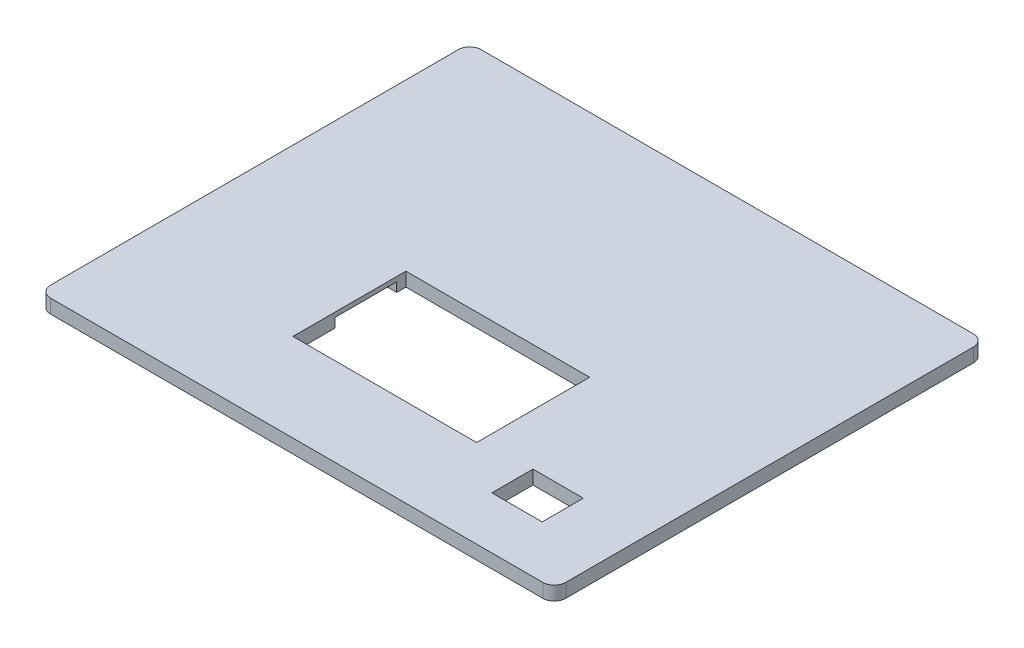
ISO-10303-21;
HEADER;
FILE_DESCRIPTION(('STEP AP214'),'2;1');
FILE_NAME('part.step','',(''),(''),'','','');
FILE_SCHEMA(('AUTOMOTIVE_DESIGN { 1 0 10303 214 1 1 1 1 }'));
ENDSEC;
DATA;
#1=APPLICATION_CONTEXT('core data for automotive mechanical design processes');
#2=APPLICATION_PROTOCOL_DEFINITION('international standard','automotive_design',2000,#1);
#3=PRODUCT_CONTEXT('',#1,'mechanical');
#4=PRODUCT('Part','Part','',(#3));
#5=PRODUCT_RELATED_PRODUCT_CATEGORY('part','',(#4));
#6=PRODUCT_DEFINITION_FORMATION('','',#4);
#7=PRODUCT_DEFINITION_CONTEXT('part definition',#1,'design');
#8=PRODUCT_DEFINITION('design','',#6,#7);
#9=PRODUCT_DEFINITION_SHAPE('','',#8);
#10=(LENGTH_UNIT() NAMED_UNIT(*) SI_UNIT(.MILLI.,.METRE.));
#11=(NAMED_UNIT(*) PLANE_ANGLE_UNIT() SI_UNIT($,.RADIAN.));
#12=(NAMED_UNIT(*) SI_UNIT($,.STERADIAN.) SOLID_ANGLE_UNIT());
#13=UNCERTAINTY_MEASURE_WITH_UNIT(LENGTH_MEASURE(1.E-05),#10,'distance_accuracy_value','');
#14=(GEOMETRIC_REPRESENTATION_CONTEXT(3) GLOBAL_UNCERTAINTY_ASSIGNED_CONTEXT((#13)) GLOBAL_UNIT_ASSIGNED_CONTEXT((#10,
#11,#12)) REPRESENTATION_CONTEXT('',''));
#15=CARTESIAN_POINT('',(0.,0.,0.));
#16=DIRECTION('',(0.,0.,1.));
#17=DIRECTION('',(1.,0.,0.));
#18=AXIS2_PLACEMENT_3D('',#15,#16,#17);
#19=CARTESIAN_POINT('',(-335.,18.,-560.));
#20=DIRECTION('',(1.,0.,0.));
#21=DIRECTION('',(0.,0.,-1.));
#22=AXIS2_PLACEMENT_3D('',#19,#20,#21);
#23=PLANE('',#22);
#24=DIRECTION('',(0.,0.,1.));
#25=VECTOR('',#24,1.);
#26=CARTESIAN_POINT('',(-335.,0.,-560.));
#27=LINE('',#26,#25);
#28=CARTESIAN_POINT('',(-335.,0.,-545.));
#29=VERTEX_POINT('',#28);
#30=CARTESIAN_POINT('',(-335.,0.,-15.));
#31=VERTEX_POINT('',#30);
#32=EDGE_CURVE('E254',#29,#31,#27,.T.);
#33=ORIENTED_EDGE('',*,*,#32,.T.);
#34=DIRECTION('',(0.,-1.,0.));
#35=VECTOR('',#34,1.);
#36=CARTESIAN_POINT('',(-335.,18.,-15.));
#37=LINE('',#36,#35);
#38=CARTESIAN_POINT('',(-335.,18.,-15.));
#39=VERTEX_POINT('',#38);
#40=EDGE_CURVE('E12',#31,#39,#37,.F.);
#41=ORIENTED_EDGE('',*,*,#40,.T.);
#42=DIRECTION('',(0.,0.,1.));
#43=VECTOR('',#42,1.);
#44=CARTESIAN_POINT('',(-335.,18.,-560.));
#45=LINE('',#44,#43);
#46=CARTESIAN_POINT('',(-335.,18.,-545.));
#47=VERTEX_POINT('',#46);
#48=EDGE_CURVE('E255',#47,#39,#45,.T.);
#49=ORIENTED_EDGE('',*,*,#48,.F.);
#50=DIRECTION('',(0.,-1.,0.));
#51=VECTOR('',#50,1.);
#52=CARTESIAN_POINT('',(-335.,18.,-545.));
#53=LINE('',#52,#51);
#54=EDGE_CURVE('E52',#47,#29,#53,.T.);
#55=ORIENTED_EDGE('',*,*,#54,.T.);
#56=EDGE_LOOP('',(#33,#41,#49,#55));
#57=FACE_BOUND('',#56,.T.);
#58=ADVANCED_FACE('F44',(#57),#23,.F.);
#59=CARTESIAN_POINT('',(-335.,18.,0.));
#60=DIRECTION('',(0.,0.,-1.));
#61=DIRECTION('',(-1.,0.,0.));
#62=AXIS2_PLACEMENT_3D('',#59,#60,#61);
#63=PLANE('',#62);
#64=DIRECTION('',(1.,0.,0.));
#65=VECTOR('',#64,1.);
#66=CARTESIAN_POINT('',(-335.,0.,0.));
#67=LINE('',#66,#65);
#68=CARTESIAN_POINT('',(-320.,0.,0.));
#69=VERTEX_POINT('',#68);
#70=CARTESIAN_POINT('',(320.,0.,-1.20321548016227E-13));
#71=VERTEX_POINT('',#70);
#72=EDGE_CURVE('E271',#69,#71,#67,.T.);
#73=ORIENTED_EDGE('',*,*,#72,.T.);
#74=DIRECTION('',(0.,-1.,0.));
#75=VECTOR('',#74,1.);
#76=CARTESIAN_POINT('',(320.,18.,-1.20321548016227E-13));
#77=LINE('',#76,#75);
#78=CARTESIAN_POINT('',(320.,18.,-1.20321548016227E-13));
#79=VERTEX_POINT('',#78);
#80=EDGE_CURVE('E67',#71,#79,#77,.F.);
#81=ORIENTED_EDGE('',*,*,#80,.T.);
#82=DIRECTION('',(1.,0.,0.));
#83=VECTOR('',#82,1.);
#84=CARTESIAN_POINT('',(-335.,18.,0.));
#85=LINE('',#84,#83);
#86=CARTESIAN_POINT('',(-320.,18.,0.));
#87=VERTEX_POINT('',#86);
#88=EDGE_CURVE('E258',#87,#79,#85,.T.);
#89=ORIENTED_EDGE('',*,*,#88,.F.);
#90=DIRECTION('',(0.,-1.,0.));
#91=VECTOR('',#90,1.);
#92=CARTESIAN_POINT('',(-320.,18.,0.));
#93=LINE('',#92,#91);
#94=EDGE_CURVE('E384',#87,#69,#93,.T.);
#95=ORIENTED_EDGE('',*,*,#94,.T.);
#96=EDGE_LOOP('',(#73,#81,#89,#95));
#97=FACE_BOUND('',#96,.T.);
#98=ADVANCED_FACE('F402',(#97),#63,.F.);
#99=CARTESIAN_POINT('',(335.,18.,-560.));
#100=DIRECTION('',(-1.,0.,0.));
#101=DIRECTION('',(0.,0.,1.));
#102=AXIS2_PLACEMENT_3D('',#99,#100,#101);
#103=PLANE('',#102);
#104=DIRECTION('',(0.,0.,-1.));
#105=VECTOR('',#104,1.);
#106=CARTESIAN_POINT('',(335.,0.,-560.));
#107=LINE('',#106,#105);
#108=CARTESIAN_POINT('',(335.,0.,-15.0000000000001));
#109=VERTEX_POINT('',#108);
#110=CARTESIAN_POINT('',(335.,0.,-545.));
#111=VERTEX_POINT('',#110);
#112=EDGE_CURVE('E357',#109,#111,#107,.T.);
#113=ORIENTED_EDGE('',*,*,#112,.T.);
#114=DIRECTION('',(0.,-1.,0.));
#115=VECTOR('',#114,1.);
#116=CARTESIAN_POINT('',(335.,18.,-545.));
#117=LINE('',#116,#115);
#118=CARTESIAN_POINT('',(335.,18.,-545.));
#119=VERTEX_POINT('',#118);
#120=EDGE_CURVE('E374',#111,#119,#117,.F.);
#121=ORIENTED_EDGE('',*,*,#120,.T.);
#122=DIRECTION('',(0.,0.,-1.));
#123=VECTOR('',#122,1.);
#124=CARTESIAN_POINT('',(335.,18.,-560.));
#125=LINE('',#124,#123);
#126=CARTESIAN_POINT('',(335.,18.,-15.0000000000001));
#127=VERTEX_POINT('',#126);
#128=EDGE_CURVE('E261',#127,#119,#125,.T.);
#129=ORIENTED_EDGE('',*,*,#128,.F.);
#130=DIRECTION('',(0.,-1.,0.));
#131=VECTOR('',#130,1.);
#132=CARTESIAN_POINT('',(335.,18.,-15.0000000000001));
#133=LINE('',#132,#131);
#134=EDGE_CURVE('E371',#127,#109,#133,.T.);
#135=ORIENTED_EDGE('',*,*,#134,.T.);
#136=EDGE_LOOP('',(#113,#121,#129,#135));
#137=FACE_BOUND('',#136,.T.);
#138=ADVANCED_FACE('F413',(#137),#103,.F.);
#139=CARTESIAN_POINT('',(-335.,18.,-560.));
#140=DIRECTION('',(0.,0.,1.));
#141=DIRECTION('',(1.,0.,0.));
#142=AXIS2_PLACEMENT_3D('',#139,#140,#141);
#143=PLANE('',#142);
#144=DIRECTION('',(-1.,0.,0.));
#145=VECTOR('',#144,1.);
#146=CARTESIAN_POINT('',(-335.,18.,-560.));
#147=LINE('',#146,#145);
#148=CARTESIAN_POINT('',(320.,18.,-560.));
#149=VERTEX_POINT('',#148);
#150=CARTESIAN_POINT('',(-320.,18.,-560.));
#151=VERTEX_POINT('',#150);
#152=EDGE_CURVE('E264',#149,#151,#147,.T.);
#153=ORIENTED_EDGE('',*,*,#152,.F.);
#154=DIRECTION('',(0.,-1.,0.));
#155=VECTOR('',#154,1.);
#156=CARTESIAN_POINT('',(320.,18.,-560.));
#157=LINE('',#156,#155);
#158=CARTESIAN_POINT('',(320.,0.,-560.));
#159=VERTEX_POINT('',#158);
#160=EDGE_CURVE('E360',#149,#159,#157,.T.);
#161=ORIENTED_EDGE('',*,*,#160,.T.);
#162=DIRECTION('',(-1.,0.,0.));
#163=VECTOR('',#162,1.);
#164=CARTESIAN_POINT('',(-335.,0.,-560.));
#165=LINE('',#164,#163);
#166=CARTESIAN_POINT('',(-320.,0.,-560.));
#167=VERTEX_POINT('',#166);
#168=EDGE_CURVE('E259',#159,#167,#165,.T.);
#169=ORIENTED_EDGE('',*,*,#168,.T.);
#170=DIRECTION('',(0.,-1.,0.));
#171=VECTOR('',#170,1.);
#172=CARTESIAN_POINT('',(-320.,18.,-560.));
#173=LINE('',#172,#171);
#174=EDGE_CURVE('E267',#167,#151,#173,.F.);
#175=ORIENTED_EDGE('',*,*,#174,.T.);
#176=EDGE_LOOP('',(#153,#161,#169,#175));
#177=FACE_BOUND('',#176,.T.);
#178=ADVANCED_FACE('F421',(#177),#143,.F.);
#179=CARTESIAN_POINT('',(0.,18.,0.));
#180=DIRECTION('',(0.,1.,0.));
#181=DIRECTION('',(0.,0.,1.));
#182=AXIS2_PLACEMENT_3D('',#179,#180,#181);
#183=PLANE('',#182);
#184=DIRECTION('',(0.,0.,1.));
#185=VECTOR('',#184,1.);
#186=CARTESIAN_POINT('',(-119.5,18.,-261.5));
#187=LINE('',#186,#185);
#188=CARTESIAN_POINT('',(-119.5,18.,-261.5));
#189=VERTEX_POINT('',#188);
#190=CARTESIAN_POINT('',(-119.5,18.,-114.5));
#191=VERTEX_POINT('',#190);
#192=EDGE_CURVE('E296',#189,#191,#187,.T.);
#193=ORIENTED_EDGE('',*,*,#192,.F.);
#194=DIRECTION('',(-1.,0.,0.));
#195=VECTOR('',#194,1.);
#196=CARTESIAN_POINT('',(-119.5,18.,-261.5));
#197=LINE('',#196,#195);
#198=CARTESIAN_POINT('',(119.5,18.,-261.5));
#199=VERTEX_POINT('',#198);
#200=EDGE_CURVE('E341',#199,#189,#197,.T.);
#201=ORIENTED_EDGE('',*,*,#200,.F.);
#202=DIRECTION('',(0.,0.,-1.));
#203=VECTOR('',#202,1.);
#204=CARTESIAN_POINT('',(119.5,18.,-261.5));
#205=LINE('',#204,#203);
#206=CARTESIAN_POINT('',(119.5,18.,-114.5));
#207=VERTEX_POINT('',#206);
#208=EDGE_CURVE('E618',#207,#199,#205,.T.);
#209=ORIENTED_EDGE('',*,*,#208,.F.);
#210=DIRECTION('',(1.,0.,0.));
#211=VECTOR('',#210,1.);
#212=CARTESIAN_POINT('',(-119.5,18.,-114.5));
#213=LINE('',#212,#211);
#214=EDGE_CURVE('E336',#191,#207,#213,.T.);
#215=ORIENTED_EDGE('',*,*,#214,.F.);
#216=EDGE_LOOP('',(#193,#201,#209,#215));
#217=FACE_BOUND('',#216,.T.);
#218=DIRECTION('',(0.,0.,1.));
#219=VECTOR('',#218,1.);
#220=CARTESIAN_POINT('',(186.072373939439,18.,0.));
#221=LINE('',#220,#219);
#222=CARTESIAN_POINT('',(186.072373939439,18.,-121.186899917603));
#223=VERTEX_POINT('',#222);
#224=CARTESIAN_POINT('',(186.072373939439,18.,-67.6868999176034));
#225=VERTEX_POINT('',#224);
#226=EDGE_CURVE('E251',#223,#225,#221,.T.);
#227=ORIENTED_EDGE('',*,*,#226,.F.);
#228=DIRECTION('',(-1.,0.,0.));
#229=VECTOR('',#228,1.);
#230=CARTESIAN_POINT('',(0.,18.,-121.186899917603));
#231=LINE('',#230,#229);
#232=CARTESIAN_POINT('',(251.572373939439,18.,-121.186899917603));
#233=VERTEX_POINT('',#232);
#234=EDGE_CURVE('E249',#233,#223,#231,.T.);
#235=ORIENTED_EDGE('',*,*,#234,.F.);
#236=DIRECTION('',(0.,0.,-1.));
#237=VECTOR('',#236,1.);
#238=CARTESIAN_POINT('',(251.572373939439,18.,2.61029384959976E-13));
#239=LINE('',#238,#237);
#240=CARTESIAN_POINT('',(251.572373939439,18.,-67.6868999176034));
#241=VERTEX_POINT('',#240);
#242=EDGE_CURVE('E247',#241,#233,#239,.T.);
#243=ORIENTED_EDGE('',*,*,#242,.F.);
#244=DIRECTION('',(1.,0.,0.));
#245=VECTOR('',#244,1.);
#246=CARTESIAN_POINT('',(0.,18.,-67.6868999176034));
#247=LINE('',#246,#245);
#248=EDGE_CURVE('E238',#225,#241,#247,.T.);
#249=ORIENTED_EDGE('',*,*,#248,.F.);
#250=EDGE_LOOP('',(#227,#235,#243,#249));
#251=FACE_BOUND('',#250,.T.);
#252=ORIENTED_EDGE('',*,*,#128,.T.);
#253=CARTESIAN_POINT('',(320.,18.,-545.));
#254=DIRECTION('',(0.,1.,0.));
#255=DIRECTION('',(0.,0.,1.));
#256=AXIS2_PLACEMENT_3D('',#253,#254,#255);
#257=CIRCLE('',#256,15.);
#258=EDGE_CURVE('E382',#119,#149,#257,.T.);
#259=ORIENTED_EDGE('',*,*,#258,.T.);
#260=ORIENTED_EDGE('',*,*,#152,.T.);
#261=CARTESIAN_POINT('',(-320.,18.,-545.));
#262=DIRECTION('',(0.,1.,0.));
#263=DIRECTION('',(0.,0.,1.));
#264=AXIS2_PLACEMENT_3D('',#261,#262,#263);
#265=CIRCLE('',#264,15.);
#266=EDGE_CURVE('E376',#151,#47,#265,.T.);
#267=ORIENTED_EDGE('',*,*,#266,.T.);
#268=ORIENTED_EDGE('',*,*,#48,.T.);
#269=CARTESIAN_POINT('',(-320.,18.,-15.));
#270=DIRECTION('',(0.,1.,0.));
#271=DIRECTION('',(0.,0.,1.));
#272=AXIS2_PLACEMENT_3D('',#269,#270,#271);
#273=CIRCLE('',#272,15.);
#274=EDGE_CURVE('E378',#39,#87,#273,.T.);
#275=ORIENTED_EDGE('',*,*,#274,.T.);
#276=ORIENTED_EDGE('',*,*,#88,.T.);
#277=CARTESIAN_POINT('',(320.,18.,-15.0000000000001));
#278=DIRECTION('',(0.,1.,0.));
#279=DIRECTION('',(0.,0.,1.));
#280=AXIS2_PLACEMENT_3D('',#277,#278,#279);
#281=CIRCLE('',#280,15.);
#282=EDGE_CURVE('E380',#79,#127,#281,.T.);
#283=ORIENTED_EDGE('',*,*,#282,.T.);
#284=EDGE_LOOP('',(#252,#259,#260,#267,#268,#275,#276,#283));
#285=FACE_BOUND('',#284,.T.);
#286=ADVANCED_FACE('F405',(#217,#251,#285),#183,.T.);
#287=CARTESIAN_POINT('',(0.,0.,0.));
#288=DIRECTION('',(0.,1.,0.));
#289=DIRECTION('',(0.,0.,1.));
#290=AXIS2_PLACEMENT_3D('',#287,#288,#289);
#291=PLANE('',#290);
#292=DIRECTION('',(0.,0.,-1.));
#293=VECTOR('',#292,1.);
#294=CARTESIAN_POINT('',(-119.5,0.,-261.5));
#295=LINE('',#294,#293);
#296=CARTESIAN_POINT('',(-119.5,0.,-249.541384694741));
#297=VERTEX_POINT('',#296);
#298=CARTESIAN_POINT('',(-119.5,0.,-261.5));
#299=VERTEX_POINT('',#298);
#300=EDGE_CURVE('E297',#297,#299,#295,.T.);
#301=ORIENTED_EDGE('',*,*,#300,.F.);
#302=DIRECTION('',(1.,0.,0.));
#303=VECTOR('',#302,1.);
#304=CARTESIAN_POINT('',(-119.5,0.,-249.541384694741));
#305=LINE('',#304,#303);
#306=CARTESIAN_POINT('',(-199.972707968302,0.,-249.541384694741));
#307=VERTEX_POINT('',#306);
#308=EDGE_CURVE('E198',#307,#297,#305,.T.);
#309=ORIENTED_EDGE('',*,*,#308,.F.);
#310=DIRECTION('',(0.,0.,-1.));
#311=VECTOR('',#310,1.);
#312=CARTESIAN_POINT('',(-199.972707968302,0.,-249.541384694741));
#313=LINE('',#312,#311);
#314=CARTESIAN_POINT('',(-199.972707968302,0.,-169.541384694741));
#315=VERTEX_POINT('',#314);
#316=EDGE_CURVE('E288',#315,#307,#313,.T.);
#317=ORIENTED_EDGE('',*,*,#316,.F.);
#318=DIRECTION('',(-1.,0.,0.));
#319=VECTOR('',#318,1.);
#320=CARTESIAN_POINT('',(-119.5,0.,-169.541384694741));
#321=LINE('',#320,#319);
#322=CARTESIAN_POINT('',(-119.5,0.,-169.541384694741));
#323=VERTEX_POINT('',#322);
#324=EDGE_CURVE('E285',#323,#315,#321,.T.);
#325=ORIENTED_EDGE('',*,*,#324,.F.);
#326=CARTESIAN_POINT('',(-119.5,0.,-114.5));
#327=VERTEX_POINT('',#326);
#328=EDGE_CURVE('E203',#327,#323,#295,.T.);
#329=ORIENTED_EDGE('',*,*,#328,.F.);
#330=DIRECTION('',(-1.,0.,0.));
#331=VECTOR('',#330,1.);
#332=CARTESIAN_POINT('',(-119.5,0.,-114.5));
#333=LINE('',#332,#331);
#334=CARTESIAN_POINT('',(119.5,0.,-114.5));
#335=VERTEX_POINT('',#334);
#336=EDGE_CURVE('E326',#335,#327,#333,.T.);
#337=ORIENTED_EDGE('',*,*,#336,.F.);
#338=DIRECTION('',(0.,0.,1.));
#339=VECTOR('',#338,1.);
#340=CARTESIAN_POINT('',(119.5,0.,-261.5));
#341=LINE('',#340,#339);
#342=CARTESIAN_POINT('',(119.5,0.,-261.5));
#343=VERTEX_POINT('',#342);
#344=EDGE_CURVE('E209',#343,#335,#341,.T.);
#345=ORIENTED_EDGE('',*,*,#344,.F.);
#346=DIRECTION('',(1.,0.,0.));
#347=VECTOR('',#346,1.);
#348=CARTESIAN_POINT('',(-119.5,0.,-261.5));
#349=LINE('',#348,#347);
#350=EDGE_CURVE('E212',#299,#343,#349,.T.);
#351=ORIENTED_EDGE('',*,*,#350,.F.);
#352=EDGE_LOOP('',(#301,#309,#317,#325,#329,#337,#345,#351));
#353=FACE_BOUND('',#352,.T.);
#354=DIRECTION('',(-1.,0.,0.));
#355=VECTOR('',#354,1.);
#356=CARTESIAN_POINT('',(186.072373939439,0.,-121.186899917603));
#357=LINE('',#356,#355);
#358=CARTESIAN_POINT('',(251.572373939439,0.,-121.186899917603));
#359=VERTEX_POINT('',#358);
#360=CARTESIAN_POINT('',(186.072373939439,0.,-121.186899917603));
#361=VERTEX_POINT('',#360);
#362=EDGE_CURVE('E226',#359,#361,#357,.T.);
#363=ORIENTED_EDGE('',*,*,#362,.T.);
#364=DIRECTION('',(0.,0.,1.));
#365=VECTOR('',#364,1.);
#366=CARTESIAN_POINT('',(186.072373939439,0.,-121.186899917603));
#367=LINE('',#366,#365);
#368=CARTESIAN_POINT('',(186.072373939439,0.,-67.6868999176034));
#369=VERTEX_POINT('',#368);
#370=EDGE_CURVE('E345',#361,#369,#367,.T.);
#371=ORIENTED_EDGE('',*,*,#370,.T.);
#372=DIRECTION('',(1.,0.,0.));
#373=VECTOR('',#372,1.);
#374=CARTESIAN_POINT('',(186.072373939439,0.,-67.6868999176034));
#375=LINE('',#374,#373);
#376=CARTESIAN_POINT('',(251.572373939439,0.,-67.6868999176034));
#377=VERTEX_POINT('',#376);
#378=EDGE_CURVE('E348',#369,#377,#375,.T.);
#379=ORIENTED_EDGE('',*,*,#378,.T.);
#380=DIRECTION('',(0.,0.,-1.));
#381=VECTOR('',#380,1.);
#382=CARTESIAN_POINT('',(251.572373939439,0.,-121.186899917603));
#383=LINE('',#382,#381);
#384=EDGE_CURVE('E232',#377,#359,#383,.T.);
#385=ORIENTED_EDGE('',*,*,#384,.T.);
#386=EDGE_LOOP('',(#363,#371,#379,#385));
#387=FACE_BOUND('',#386,.T.);
#388=ORIENTED_EDGE('',*,*,#168,.F.);
#389=CARTESIAN_POINT('',(320.,0.,-545.));
#390=DIRECTION('',(0.,1.,0.));
#391=DIRECTION('',(0.,0.,1.));
#392=AXIS2_PLACEMENT_3D('',#389,#390,#391);
#393=CIRCLE('',#392,15.);
#394=EDGE_CURVE('E369',#159,#111,#393,.F.);
#395=ORIENTED_EDGE('',*,*,#394,.T.);
#396=ORIENTED_EDGE('',*,*,#112,.F.);
#397=CARTESIAN_POINT('',(320.,0.,-15.0000000000001));
#398=DIRECTION('',(0.,1.,0.));
#399=DIRECTION('',(0.,0.,1.));
#400=AXIS2_PLACEMENT_3D('',#397,#398,#399);
#401=CIRCLE('',#400,15.);
#402=EDGE_CURVE('E367',#109,#71,#401,.F.);
#403=ORIENTED_EDGE('',*,*,#402,.T.);
#404=ORIENTED_EDGE('',*,*,#72,.F.);
#405=CARTESIAN_POINT('',(-320.,0.,-15.));
#406=DIRECTION('',(0.,1.,0.));
#407=DIRECTION('',(0.,0.,1.));
#408=AXIS2_PLACEMENT_3D('',#405,#406,#407);
#409=CIRCLE('',#408,15.);
#410=EDGE_CURVE('E365',#69,#31,#409,.F.);
#411=ORIENTED_EDGE('',*,*,#410,.T.);
#412=ORIENTED_EDGE('',*,*,#32,.F.);
#413=CARTESIAN_POINT('',(-320.,0.,-545.));
#414=DIRECTION('',(0.,1.,0.));
#415=DIRECTION('',(0.,0.,1.));
#416=AXIS2_PLACEMENT_3D('',#413,#414,#415);
#417=CIRCLE('',#416,15.);
#418=EDGE_CURVE('E363',#29,#167,#417,.F.);
#419=ORIENTED_EDGE('',*,*,#418,.T.);
#420=EDGE_LOOP('',(#388,#395,#396,#403,#404,#411,#412,#419));
#421=FACE_BOUND('',#420,.T.);
#422=ADVANCED_FACE('F312',(#353,#387,#421),#291,.F.);
#423=CARTESIAN_POINT('',(186.072373939439,0.,-121.186899917603));
#424=DIRECTION('',(-1.,0.,0.));
#425=DIRECTION('',(0.,0.,1.));
#426=AXIS2_PLACEMENT_3D('',#423,#424,#425);
#427=PLANE('',#426);
#428=ORIENTED_EDGE('',*,*,#226,.T.);
#429=DIRECTION('',(0.,1.,0.));
#430=VECTOR('',#429,1.);
#431=CARTESIAN_POINT('',(186.072373939439,0.,-67.6868999176034));
#432=LINE('',#431,#430);
#433=EDGE_CURVE('E231',#369,#225,#432,.T.);
#434=ORIENTED_EDGE('',*,*,#433,.F.);
#435=ORIENTED_EDGE('',*,*,#370,.F.);
#436=DIRECTION('',(0.,1.,0.));
#437=VECTOR('',#436,1.);
#438=CARTESIAN_POINT('',(186.072373939439,0.,-121.186899917603));
#439=LINE('',#438,#437);
#440=EDGE_CURVE('E235',#361,#223,#439,.T.);
#441=ORIENTED_EDGE('',*,*,#440,.T.);
#442=EDGE_LOOP('',(#428,#434,#435,#441));
#443=FACE_BOUND('',#442,.T.);
#444=ADVANCED_FACE('F503',(#443),#427,.F.);
#445=CARTESIAN_POINT('',(186.072373939439,0.,-121.186899917603));
#446=DIRECTION('',(0.,0.,-1.));
#447=DIRECTION('',(-1.,0.,0.));
#448=AXIS2_PLACEMENT_3D('',#445,#446,#447);
#449=PLANE('',#448);
#450=ORIENTED_EDGE('',*,*,#234,.T.);
#451=ORIENTED_EDGE('',*,*,#440,.F.);
#452=ORIENTED_EDGE('',*,*,#362,.F.);
#453=DIRECTION('',(0.,1.,0.));
#454=VECTOR('',#453,1.);
#455=CARTESIAN_POINT('',(251.572373939439,0.,-121.186899917603));
#456=LINE('',#455,#454);
#457=EDGE_CURVE('E239',#359,#233,#456,.T.);
#458=ORIENTED_EDGE('',*,*,#457,.T.);
#459=EDGE_LOOP('',(#450,#451,#452,#458));
#460=FACE_BOUND('',#459,.T.);
#461=ADVANCED_FACE('F499',(#460),#449,.F.);
#462=CARTESIAN_POINT('',(251.572373939439,0.,-121.186899917603));
#463=DIRECTION('',(1.,0.,0.));
#464=DIRECTION('',(0.,0.,-1.));
#465=AXIS2_PLACEMENT_3D('',#462,#463,#464);
#466=PLANE('',#465);
#467=ORIENTED_EDGE('',*,*,#242,.T.);
#468=ORIENTED_EDGE('',*,*,#457,.F.);
#469=ORIENTED_EDGE('',*,*,#384,.F.);
#470=DIRECTION('',(0.,1.,0.));
#471=VECTOR('',#470,1.);
#472=CARTESIAN_POINT('',(251.572373939439,0.,-67.6868999176034));
#473=LINE('',#472,#471);
#474=EDGE_CURVE('E242',#377,#241,#473,.T.);
#475=ORIENTED_EDGE('',*,*,#474,.T.);
#476=EDGE_LOOP('',(#467,#468,#469,#475));
#477=FACE_BOUND('',#476,.T.);
#478=ADVANCED_FACE('F502',(#477),#466,.F.);
#479=CARTESIAN_POINT('',(186.072373939439,0.,-67.6868999176034));
#480=DIRECTION('',(0.,0.,1.));
#481=DIRECTION('',(1.,0.,0.));
#482=AXIS2_PLACEMENT_3D('',#479,#480,#481);
#483=PLANE('',#482);
#484=ORIENTED_EDGE('',*,*,#248,.T.);
#485=ORIENTED_EDGE('',*,*,#474,.F.);
#486=ORIENTED_EDGE('',*,*,#378,.F.);
#487=ORIENTED_EDGE('',*,*,#433,.T.);
#488=EDGE_LOOP('',(#484,#485,#486,#487));
#489=FACE_BOUND('',#488,.T.);
#490=ADVANCED_FACE('F498',(#489),#483,.F.);
#491=CARTESIAN_POINT('',(-119.5,-0.001000000000001,-261.5));
#492=DIRECTION('',(-1.,0.,0.));
#493=DIRECTION('',(0.,0.,1.));
#494=AXIS2_PLACEMENT_3D('',#491,#492,#493);
#495=PLANE('',#494);
#496=DIRECTION('',(0.,0.,1.));
#497=VECTOR('',#496,1.);
#498=CARTESIAN_POINT('',(-119.5,12.,-249.541384694741));
#499=LINE('',#498,#497);
#500=CARTESIAN_POINT('',(-119.5,12.,-249.541384694741));
#501=VERTEX_POINT('',#500);
#502=CARTESIAN_POINT('',(-119.5,12.,-169.541384694741));
#503=VERTEX_POINT('',#502);
#504=EDGE_CURVE('E192',#501,#503,#499,.T.);
#505=ORIENTED_EDGE('',*,*,#504,.F.);
#506=DIRECTION('',(0.,-1.,0.));
#507=VECTOR('',#506,1.);
#508=CARTESIAN_POINT('',(-119.5,12.,-249.541384694741));
#509=LINE('',#508,#507);
#510=EDGE_CURVE('E213',#501,#297,#509,.T.);
#511=ORIENTED_EDGE('',*,*,#510,.T.);
#512=ORIENTED_EDGE('',*,*,#300,.T.);
#513=DIRECTION('',(0.,1.,0.));
#514=VECTOR('',#513,1.);
#515=CARTESIAN_POINT('',(-119.5,-0.001000000000001,-261.5));
#516=LINE('',#515,#514);
#517=EDGE_CURVE('E323',#299,#189,#516,.T.);
#518=ORIENTED_EDGE('',*,*,#517,.T.);
#519=ORIENTED_EDGE('',*,*,#192,.T.);
#520=DIRECTION('',(0.,1.,0.));
#521=VECTOR('',#520,1.);
#522=CARTESIAN_POINT('',(-119.5,-0.001000000000001,-114.5));
#523=LINE('',#522,#521);
#524=EDGE_CURVE('E338',#327,#191,#523,.T.);
#525=ORIENTED_EDGE('',*,*,#524,.F.);
#526=ORIENTED_EDGE('',*,*,#328,.T.);
#527=DIRECTION('',(0.,-1.,0.));
#528=VECTOR('',#527,1.);
#529=CARTESIAN_POINT('',(-119.5,12.,-169.541384694741));
#530=LINE('',#529,#528);
#531=EDGE_CURVE('E187',#503,#323,#530,.T.);
#532=ORIENTED_EDGE('',*,*,#531,.F.);
#533=EDGE_LOOP('',(#505,#511,#512,#518,#519,#525,#526,#532));
#534=FACE_BOUND('',#533,.T.);
#535=ADVANCED_FACE('F201',(#534),#495,.F.);
#536=CARTESIAN_POINT('',(-119.5,-0.001000000000001,-261.5));
#537=DIRECTION('',(0.,0.,-1.));
#538=DIRECTION('',(-1.,0.,0.));
#539=AXIS2_PLACEMENT_3D('',#536,#537,#538);
#540=PLANE('',#539);
#541=ORIENTED_EDGE('',*,*,#350,.T.);
#542=DIRECTION('',(0.,1.,0.));
#543=VECTOR('',#542,1.);
#544=CARTESIAN_POINT('',(119.5,-0.001000000000001,-261.5));
#545=LINE('',#544,#543);
#546=EDGE_CURVE('E321',#343,#199,#545,.T.);
#547=ORIENTED_EDGE('',*,*,#546,.T.);
#548=ORIENTED_EDGE('',*,*,#200,.T.);
#549=ORIENTED_EDGE('',*,*,#517,.F.);
#550=EDGE_LOOP('',(#541,#547,#548,#549));
#551=FACE_BOUND('',#550,.T.);
#552=ADVANCED_FACE('F319',(#551),#540,.F.);
#553=CARTESIAN_POINT('',(119.5,-0.001000000000001,-261.5));
#554=DIRECTION('',(1.,0.,0.));
#555=DIRECTION('',(0.,0.,-1.));
#556=AXIS2_PLACEMENT_3D('',#553,#554,#555);
#557=PLANE('',#556);
#558=ORIENTED_EDGE('',*,*,#344,.T.);
#559=DIRECTION('',(0.,1.,0.));
#560=VECTOR('',#559,1.);
#561=CARTESIAN_POINT('',(119.5,-0.001000000000001,-114.5));
#562=LINE('',#561,#560);
#563=EDGE_CURVE('E330',#335,#207,#562,.T.);
#564=ORIENTED_EDGE('',*,*,#563,.T.);
#565=ORIENTED_EDGE('',*,*,#208,.T.);
#566=ORIENTED_EDGE('',*,*,#546,.F.);
#567=EDGE_LOOP('',(#558,#564,#565,#566));
#568=FACE_BOUND('',#567,.T.);
#569=ADVANCED_FACE('F329',(#568),#557,.F.);
#570=CARTESIAN_POINT('',(-119.5,-0.001000000000001,-114.5));
#571=DIRECTION('',(0.,0.,1.));
#572=DIRECTION('',(1.,0.,0.));
#573=AXIS2_PLACEMENT_3D('',#570,#571,#572);
#574=PLANE('',#573);
#575=ORIENTED_EDGE('',*,*,#336,.T.);
#576=ORIENTED_EDGE('',*,*,#524,.T.);
#577=ORIENTED_EDGE('',*,*,#214,.T.);
#578=ORIENTED_EDGE('',*,*,#563,.F.);
#579=EDGE_LOOP('',(#575,#576,#577,#578));
#580=FACE_BOUND('',#579,.T.);
#581=ADVANCED_FACE('F333',(#580),#574,.F.);
#582=CARTESIAN_POINT('',(320.,18.,-545.));
#583=DIRECTION('',(0.,-1.,0.));
#584=DIRECTION('',(0.,0.,-1.));
#585=AXIS2_PLACEMENT_3D('',#582,#583,#584);
#586=CYLINDRICAL_SURFACE('',#585,15.);
#587=ORIENTED_EDGE('',*,*,#258,.F.);
#588=ORIENTED_EDGE('',*,*,#120,.F.);
#589=ORIENTED_EDGE('',*,*,#394,.F.);
#590=ORIENTED_EDGE('',*,*,#160,.F.);
#591=EDGE_LOOP('',(#587,#588,#589,#590));
#592=FACE_BOUND('',#591,.T.);
#593=ADVANCED_FACE('F418',(#592),#586,.T.);
#594=CARTESIAN_POINT('',(320.,18.,-15.0000000000001));
#595=DIRECTION('',(0.,-1.,0.));
#596=DIRECTION('',(0.,0.,-1.));
#597=AXIS2_PLACEMENT_3D('',#594,#595,#596);
#598=CYLINDRICAL_SURFACE('',#597,15.);
#599=ORIENTED_EDGE('',*,*,#282,.F.);
#600=ORIENTED_EDGE('',*,*,#80,.F.);
#601=ORIENTED_EDGE('',*,*,#402,.F.);
#602=ORIENTED_EDGE('',*,*,#134,.F.);
#603=EDGE_LOOP('',(#599,#600,#601,#602));
#604=FACE_BOUND('',#603,.T.);
#605=ADVANCED_FACE('F409',(#604),#598,.T.);
#606=CARTESIAN_POINT('',(-320.,18.,-15.));
#607=DIRECTION('',(0.,-1.,0.));
#608=DIRECTION('',(0.,0.,-1.));
#609=AXIS2_PLACEMENT_3D('',#606,#607,#608);
#610=CYLINDRICAL_SURFACE('',#609,15.);
#611=ORIENTED_EDGE('',*,*,#274,.F.);
#612=ORIENTED_EDGE('',*,*,#40,.F.);
#613=ORIENTED_EDGE('',*,*,#410,.F.);
#614=ORIENTED_EDGE('',*,*,#94,.F.);
#615=EDGE_LOOP('',(#611,#612,#613,#614));
#616=FACE_BOUND('',#615,.T.);
#617=ADVANCED_FACE('F401',(#616),#610,.T.);
#618=CARTESIAN_POINT('',(-320.,18.,-545.));
#619=DIRECTION('',(0.,-1.,0.));
#620=DIRECTION('',(0.,0.,-1.));
#621=AXIS2_PLACEMENT_3D('',#618,#619,#620);
#622=CYLINDRICAL_SURFACE('',#621,15.);
#623=ORIENTED_EDGE('',*,*,#266,.F.);
#624=ORIENTED_EDGE('',*,*,#174,.F.);
#625=ORIENTED_EDGE('',*,*,#418,.F.);
#626=ORIENTED_EDGE('',*,*,#54,.F.);
#627=EDGE_LOOP('',(#623,#624,#625,#626));
#628=FACE_BOUND('',#627,.T.);
#629=ADVANCED_FACE('F46',(#628),#622,.T.);
#630=CARTESIAN_POINT('',(-119.5,12.,-249.541384694741));
#631=DIRECTION('',(0.,0.,-1.));
#632=DIRECTION('',(-1.,0.,0.));
#633=AXIS2_PLACEMENT_3D('',#630,#631,#632);
#634=PLANE('',#633);
#635=ORIENTED_EDGE('',*,*,#308,.T.);
#636=ORIENTED_EDGE('',*,*,#510,.F.);
#637=DIRECTION('',(1.,0.,0.));
#638=VECTOR('',#637,1.);
#639=CARTESIAN_POINT('',(-119.5,12.,-249.541384694741));
#640=LINE('',#639,#638);
#641=CARTESIAN_POINT('',(-199.972707968302,12.,-249.541384694741));
#642=VERTEX_POINT('',#641);
#643=EDGE_CURVE('E59',#642,#501,#640,.T.);
#644=ORIENTED_EDGE('',*,*,#643,.F.);
#645=DIRECTION('',(0.,-1.,0.));
#646=VECTOR('',#645,1.);
#647=CARTESIAN_POINT('',(-199.972707968302,12.,-249.541384694741));
#648=LINE('',#647,#646);
#649=EDGE_CURVE('E205',#642,#307,#648,.T.);
#650=ORIENTED_EDGE('',*,*,#649,.T.);
#651=EDGE_LOOP('',(#635,#636,#644,#650));
#652=FACE_BOUND('',#651,.T.);
#653=ADVANCED_FACE('F305',(#652),#634,.F.);
#654=CARTESIAN_POINT('',(-199.972707968302,12.,-249.541384694741));
#655=DIRECTION('',(-1.,0.,0.));
#656=DIRECTION('',(0.,0.,1.));
#657=AXIS2_PLACEMENT_3D('',#654,#655,#656);
#658=PLANE('',#657);
#659=ORIENTED_EDGE('',*,*,#316,.T.);
#660=ORIENTED_EDGE('',*,*,#649,.F.);
#661=DIRECTION('',(0.,0.,-1.));
#662=VECTOR('',#661,1.);
#663=CARTESIAN_POINT('',(-199.972707968302,12.,-249.541384694741));
#664=LINE('',#663,#662);
#665=CARTESIAN_POINT('',(-199.972707968302,12.,-169.541384694741));
#666=VERTEX_POINT('',#665);
#667=EDGE_CURVE('E191',#666,#642,#664,.T.);
#668=ORIENTED_EDGE('',*,*,#667,.F.);
#669=DIRECTION('',(0.,-1.,0.));
#670=VECTOR('',#669,1.);
#671=CARTESIAN_POINT('',(-199.972707968302,12.,-169.541384694741));
#672=LINE('',#671,#670);
#673=EDGE_CURVE('E189',#666,#315,#672,.T.);
#674=ORIENTED_EDGE('',*,*,#673,.T.);
#675=EDGE_LOOP('',(#659,#660,#668,#674));
#676=FACE_BOUND('',#675,.T.);
#677=ADVANCED_FACE('F309',(#676),#658,.F.);
#678=CARTESIAN_POINT('',(-119.5,12.,-169.541384694741));
#679=DIRECTION('',(0.,0.,1.));
#680=DIRECTION('',(1.,0.,0.));
#681=AXIS2_PLACEMENT_3D('',#678,#679,#680);
#682=PLANE('',#681);
#683=ORIENTED_EDGE('',*,*,#324,.T.);
#684=ORIENTED_EDGE('',*,*,#673,.F.);
#685=DIRECTION('',(-1.,0.,0.));
#686=VECTOR('',#685,1.);
#687=CARTESIAN_POINT('',(-119.5,12.,-169.541384694741));
#688=LINE('',#687,#686);
#689=EDGE_CURVE('E183',#503,#666,#688,.T.);
#690=ORIENTED_EDGE('',*,*,#689,.F.);
#691=ORIENTED_EDGE('',*,*,#531,.T.);
#692=EDGE_LOOP('',(#683,#684,#690,#691));
#693=FACE_BOUND('',#692,.T.);
#694=ADVANCED_FACE('F185',(#693),#682,.F.);
#695=CARTESIAN_POINT('',(0.,12.,0.));
#696=DIRECTION('',(0.,-1.,0.));
#697=DIRECTION('',(0.,0.,-1.));
#698=AXIS2_PLACEMENT_3D('',#695,#696,#697);
#699=PLANE('',#698);
#700=ORIENTED_EDGE('',*,*,#504,.T.);
#701=ORIENTED_EDGE('',*,*,#689,.T.);
#702=ORIENTED_EDGE('',*,*,#667,.T.);
#703=ORIENTED_EDGE('',*,*,#643,.T.);
#704=EDGE_LOOP('',(#700,#701,#702,#703));
#705=FACE_BOUND('',#704,.T.);
#706=ADVANCED_FACE('F195',(#705),#699,.T.);
#707=CLOSED_SHELL('',(#58,#98,#138,#178,#286,#422,#444,#461,#478,#490,#535,#552,#569,#581,#593,
#605,#617,#629,#653,#677,#694,#706));
#708=MANIFOLD_SOLID_BREP('B2',#707);
#709=ADVANCED_BREP_SHAPE_REPRESENTATION('',(#18,#708),#14);
#710=SHAPE_DEFINITION_REPRESENTATION(#9,#709);
ENDSEC;
END-ISO-10303-21;
